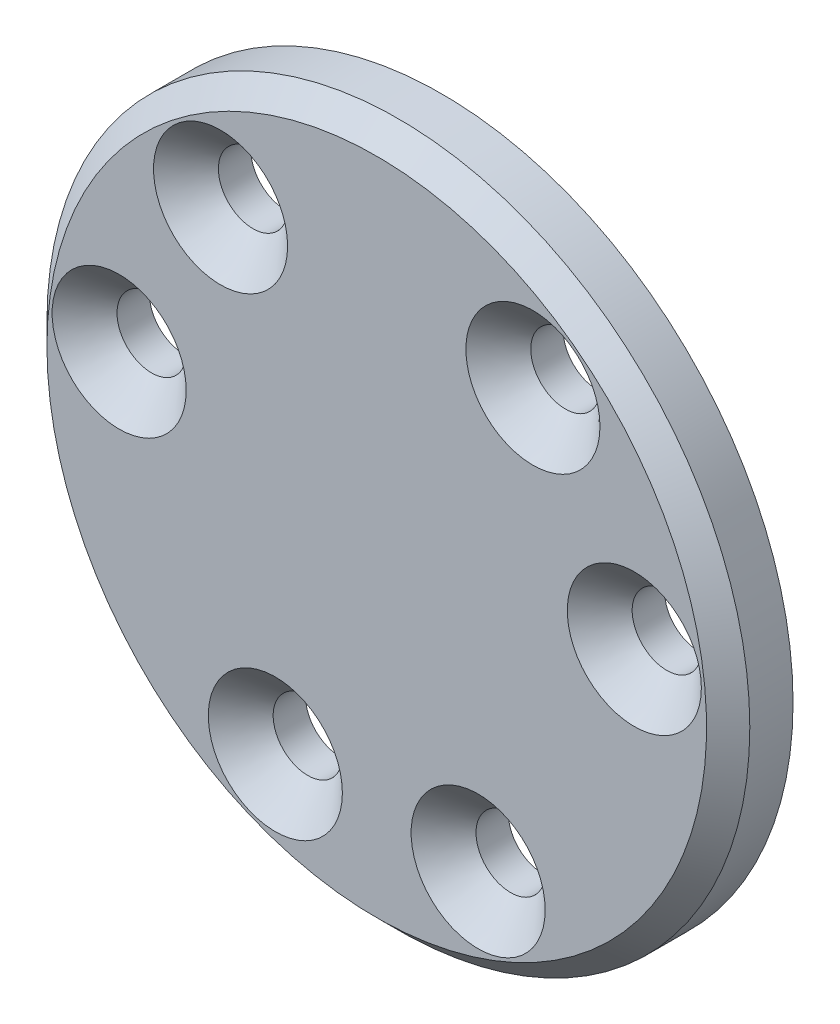
ISO-10303-21;
HEADER;
FILE_DESCRIPTION(('STEP AP214'),'2;1');
FILE_NAME('part.step','',(''),(''),'','','');
FILE_SCHEMA(('AUTOMOTIVE_DESIGN { 1 0 10303 214 1 1 1 1 }'));
ENDSEC;
DATA;
#1=APPLICATION_CONTEXT('core data for automotive mechanical design processes');
#2=APPLICATION_PROTOCOL_DEFINITION('international standard','automotive_design',2000,#1);
#3=PRODUCT_CONTEXT('',#1,'mechanical');
#4=PRODUCT('Part','Part','',(#3));
#5=PRODUCT_RELATED_PRODUCT_CATEGORY('part','',(#4));
#6=PRODUCT_DEFINITION_FORMATION('','',#4);
#7=PRODUCT_DEFINITION_CONTEXT('part definition',#1,'design');
#8=PRODUCT_DEFINITION('design','',#6,#7);
#9=PRODUCT_DEFINITION_SHAPE('','',#8);
#10=(LENGTH_UNIT() NAMED_UNIT(*) SI_UNIT(.MILLI.,.METRE.));
#11=(NAMED_UNIT(*) PLANE_ANGLE_UNIT() SI_UNIT($,.RADIAN.));
#12=(NAMED_UNIT(*) SI_UNIT($,.STERADIAN.) SOLID_ANGLE_UNIT());
#13=UNCERTAINTY_MEASURE_WITH_UNIT(LENGTH_MEASURE(1.E-05),#10,'distance_accuracy_value','');
#14=(GEOMETRIC_REPRESENTATION_CONTEXT(3) GLOBAL_UNCERTAINTY_ASSIGNED_CONTEXT((#13)) GLOBAL_UNIT_ASSIGNED_CONTEXT((#10,
#11,#12)) REPRESENTATION_CONTEXT('',''));
#15=CARTESIAN_POINT('',(0.,0.,0.));
#16=DIRECTION('',(0.,0.,1.));
#17=DIRECTION('',(1.,0.,0.));
#18=AXIS2_PLACEMENT_3D('',#15,#16,#17);
#19=CARTESIAN_POINT('',(0.,0.,0.));
#20=DIRECTION('',(0.,0.,-1.));
#21=DIRECTION('',(-1.,0.,0.));
#22=AXIS2_PLACEMENT_3D('',#19,#20,#21);
#23=CYLINDRICAL_SURFACE('',#22,16.25);
#24=CARTESIAN_POINT('',(0.,0.,0.));
#25=DIRECTION('',(0.,0.,-1.));
#26=DIRECTION('',(-1.,0.,0.));
#27=AXIS2_PLACEMENT_3D('',#24,#25,#26);
#28=CIRCLE('',#27,16.25);
#29=CARTESIAN_POINT('',(-16.25,0.,0.));
#30=VERTEX_POINT('',#29);
#31=EDGE_CURVE('E17',#30,#30,#28,.T.);
#32=ORIENTED_EDGE('',*,*,#31,.F.);
#33=EDGE_LOOP('',(#32));
#34=FACE_BOUND('',#33,.T.);
#35=CARTESIAN_POINT('',(0.,0.,2.));
#36=DIRECTION('',(0.,0.,-1.));
#37=DIRECTION('',(-1.,0.,0.));
#38=AXIS2_PLACEMENT_3D('',#35,#36,#37);
#39=CIRCLE('',#38,16.25);
#40=CARTESIAN_POINT('',(-16.25,0.,2.));
#41=VERTEX_POINT('',#40);
#42=EDGE_CURVE('E30',#41,#41,#39,.F.);
#43=ORIENTED_EDGE('',*,*,#42,.F.);
#44=EDGE_LOOP('',(#43));
#45=FACE_BOUND('',#44,.T.);
#46=ADVANCED_FACE('F14',(#34,#45),#23,.T.);
#47=CARTESIAN_POINT('',(-7.221780278,9.583626121,0.));
#48=DIRECTION('',(0.,0.,1.));
#49=DIRECTION('',(1.,0.,0.));
#50=AXIS2_PLACEMENT_3D('',#47,#48,#49);
#51=CYLINDRICAL_SURFACE('',#50,1.6);
#52=CARTESIAN_POINT('',(-7.221780278,9.583626121,0.));
#53=DIRECTION('',(0.,0.,1.));
#54=DIRECTION('',(1.,0.,0.));
#55=AXIS2_PLACEMENT_3D('',#52,#53,#54);
#56=CIRCLE('',#55,1.6);
#57=CARTESIAN_POINT('',(-5.621780278,9.583626121,0.));
#58=VERTEX_POINT('',#57);
#59=EDGE_CURVE('E59',#58,#58,#56,.T.);
#60=ORIENTED_EDGE('',*,*,#59,.F.);
#61=EDGE_LOOP('',(#60));
#62=FACE_BOUND('',#61,.T.);
#63=CARTESIAN_POINT('',(-7.221780278,9.583626121,1.49999999999995));
#64=DIRECTION('',(0.,0.,1.));
#65=DIRECTION('',(1.,0.,0.));
#66=AXIS2_PLACEMENT_3D('',#63,#64,#65);
#67=CIRCLE('',#66,1.6);
#68=CARTESIAN_POINT('',(-5.621780278,9.583626121,1.5));
#69=VERTEX_POINT('',#68);
#70=EDGE_CURVE('E79',#69,#69,#67,.F.);
#71=ORIENTED_EDGE('',*,*,#70,.F.);
#72=EDGE_LOOP('',(#71));
#73=FACE_BOUND('',#72,.T.);
#74=ADVANCED_FACE('F75',(#62,#73),#51,.F.);
#75=CARTESIAN_POINT('',(11.91055382,1.462432121,0.));
#76=DIRECTION('',(0.,0.,1.));
#77=DIRECTION('',(1.,0.,0.));
#78=AXIS2_PLACEMENT_3D('',#75,#76,#77);
#79=CYLINDRICAL_SURFACE('',#78,1.6);
#80=CARTESIAN_POINT('',(11.91055382,1.462432121,0.));
#81=DIRECTION('',(0.,0.,1.));
#82=DIRECTION('',(1.,0.,0.));
#83=AXIS2_PLACEMENT_3D('',#80,#81,#82);
#84=CIRCLE('',#83,1.6);
#85=CARTESIAN_POINT('',(13.51055382,1.462432121,0.));
#86=VERTEX_POINT('',#85);
#87=EDGE_CURVE('E56',#86,#86,#84,.T.);
#88=ORIENTED_EDGE('',*,*,#87,.F.);
#89=EDGE_LOOP('',(#88));
#90=FACE_BOUND('',#89,.T.);
#91=CARTESIAN_POINT('',(11.91055382,1.462432121,1.49999999999995));
#92=DIRECTION('',(0.,0.,1.));
#93=DIRECTION('',(1.,0.,0.));
#94=AXIS2_PLACEMENT_3D('',#91,#92,#93);
#95=CIRCLE('',#94,1.6);
#96=CARTESIAN_POINT('',(13.51055382,1.462432121,1.5));
#97=VERTEX_POINT('',#96);
#98=EDGE_CURVE('E81',#97,#97,#95,.F.);
#99=ORIENTED_EDGE('',*,*,#98,.F.);
#100=EDGE_LOOP('',(#99));
#101=FACE_BOUND('',#100,.T.);
#102=ADVANCED_FACE('F232',(#90,#101),#79,.F.);
#103=CARTESIAN_POINT('',(7.221780278,9.583626121,0.));
#104=DIRECTION('',(0.,0.,1.));
#105=DIRECTION('',(1.,0.,0.));
#106=AXIS2_PLACEMENT_3D('',#103,#104,#105);
#107=CYLINDRICAL_SURFACE('',#106,1.6);
#108=CARTESIAN_POINT('',(7.221780278,9.583626121,0.));
#109=DIRECTION('',(0.,0.,1.));
#110=DIRECTION('',(1.,0.,0.));
#111=AXIS2_PLACEMENT_3D('',#108,#109,#110);
#112=CIRCLE('',#111,1.6);
#113=CARTESIAN_POINT('',(8.821780278,9.583626121,0.));
#114=VERTEX_POINT('',#113);
#115=EDGE_CURVE('E53',#114,#114,#112,.T.);
#116=ORIENTED_EDGE('',*,*,#115,.F.);
#117=EDGE_LOOP('',(#116));
#118=FACE_BOUND('',#117,.T.);
#119=CARTESIAN_POINT('',(7.221780278,9.583626121,1.49999999999995));
#120=DIRECTION('',(0.,0.,1.));
#121=DIRECTION('',(1.,0.,0.));
#122=AXIS2_PLACEMENT_3D('',#119,#120,#121);
#123=CIRCLE('',#122,1.6);
#124=CARTESIAN_POINT('',(8.821780278,9.583626121,1.5));
#125=VERTEX_POINT('',#124);
#126=EDGE_CURVE('E85',#125,#125,#123,.F.);
#127=ORIENTED_EDGE('',*,*,#126,.F.);
#128=EDGE_LOOP('',(#127));
#129=FACE_BOUND('',#128,.T.);
#130=ADVANCED_FACE('F112',(#118,#129),#107,.F.);
#131=CARTESIAN_POINT('',(4.688773542,-11.046058241,0.));
#132=DIRECTION('',(0.,0.,1.));
#133=DIRECTION('',(1.,0.,0.));
#134=AXIS2_PLACEMENT_3D('',#131,#132,#133);
#135=CYLINDRICAL_SURFACE('',#134,1.6);
#136=CARTESIAN_POINT('',(4.688773542,-11.046058241,0.));
#137=DIRECTION('',(0.,0.,1.));
#138=DIRECTION('',(1.,0.,0.));
#139=AXIS2_PLACEMENT_3D('',#136,#137,#138);
#140=CIRCLE('',#139,1.6);
#141=CARTESIAN_POINT('',(6.288773542,-11.046058241,0.));
#142=VERTEX_POINT('',#141);
#143=EDGE_CURVE('E64',#142,#142,#140,.T.);
#144=ORIENTED_EDGE('',*,*,#143,.F.);
#145=EDGE_LOOP('',(#144));
#146=FACE_BOUND('',#145,.T.);
#147=CARTESIAN_POINT('',(4.688773542,-11.046058241,1.49999999999995));
#148=DIRECTION('',(0.,0.,1.));
#149=DIRECTION('',(1.,0.,0.));
#150=AXIS2_PLACEMENT_3D('',#147,#148,#149);
#151=CIRCLE('',#150,1.6);
#152=CARTESIAN_POINT('',(6.288773542,-11.046058241,1.5));
#153=VERTEX_POINT('',#152);
#154=EDGE_CURVE('E90',#153,#153,#151,.F.);
#155=ORIENTED_EDGE('',*,*,#154,.F.);
#156=EDGE_LOOP('',(#155));
#157=FACE_BOUND('',#156,.T.);
#158=ADVANCED_FACE('F101',(#146,#157),#135,.F.);
#159=CARTESIAN_POINT('',(-4.688773542,-11.046058241,0.));
#160=DIRECTION('',(0.,0.,1.));
#161=DIRECTION('',(1.,0.,0.));
#162=AXIS2_PLACEMENT_3D('',#159,#160,#161);
#163=CYLINDRICAL_SURFACE('',#162,1.6);
#164=CARTESIAN_POINT('',(-4.688773542,-11.046058241,0.));
#165=DIRECTION('',(0.,0.,1.));
#166=DIRECTION('',(1.,0.,0.));
#167=AXIS2_PLACEMENT_3D('',#164,#165,#166);
#168=CIRCLE('',#167,1.6);
#169=CARTESIAN_POINT('',(-3.088773542,-11.046058241,0.));
#170=VERTEX_POINT('',#169);
#171=EDGE_CURVE('E62',#170,#170,#168,.T.);
#172=ORIENTED_EDGE('',*,*,#171,.F.);
#173=EDGE_LOOP('',(#172));
#174=FACE_BOUND('',#173,.T.);
#175=CARTESIAN_POINT('',(-4.688773542,-11.046058241,1.49999999999995));
#176=DIRECTION('',(0.,0.,1.));
#177=DIRECTION('',(1.,0.,0.));
#178=AXIS2_PLACEMENT_3D('',#175,#176,#177);
#179=CIRCLE('',#178,1.6);
#180=CARTESIAN_POINT('',(-3.088773542,-11.046058241,1.5));
#181=VERTEX_POINT('',#180);
#182=EDGE_CURVE('E52',#181,#181,#179,.F.);
#183=ORIENTED_EDGE('',*,*,#182,.F.);
#184=EDGE_LOOP('',(#183));
#185=FACE_BOUND('',#184,.T.);
#186=ADVANCED_FACE('F99',(#174,#185),#163,.F.);
#187=CARTESIAN_POINT('',(0.,0.,0.));
#188=DIRECTION('',(0.,0.,1.));
#189=DIRECTION('',(1.,0.,0.));
#190=AXIS2_PLACEMENT_3D('',#187,#188,#189);
#191=PLANE('',#190);
#192=ORIENTED_EDGE('',*,*,#115,.T.);
#193=EDGE_LOOP('',(#192));
#194=FACE_BOUND('',#193,.T.);
#195=ORIENTED_EDGE('',*,*,#87,.T.);
#196=EDGE_LOOP('',(#195));
#197=FACE_BOUND('',#196,.T.);
#198=ORIENTED_EDGE('',*,*,#59,.T.);
#199=EDGE_LOOP('',(#198));
#200=FACE_BOUND('',#199,.T.);
#201=CARTESIAN_POINT('',(-11.91055382,1.462432121,0.));
#202=DIRECTION('',(0.,0.,1.));
#203=DIRECTION('',(1.,0.,0.));
#204=AXIS2_PLACEMENT_3D('',#201,#202,#203);
#205=CIRCLE('',#204,1.6);
#206=CARTESIAN_POINT('',(-10.31055382,1.462432121,0.));
#207=VERTEX_POINT('',#206);
#208=EDGE_CURVE('E49',#207,#207,#205,.F.);
#209=ORIENTED_EDGE('',*,*,#208,.F.);
#210=EDGE_LOOP('',(#209));
#211=FACE_BOUND('',#210,.T.);
#212=ORIENTED_EDGE('',*,*,#171,.T.);
#213=EDGE_LOOP('',(#212));
#214=FACE_BOUND('',#213,.T.);
#215=ORIENTED_EDGE('',*,*,#143,.T.);
#216=EDGE_LOOP('',(#215));
#217=FACE_BOUND('',#216,.T.);
#218=ORIENTED_EDGE('',*,*,#31,.T.);
#219=EDGE_LOOP('',(#218));
#220=FACE_BOUND('',#219,.T.);
#221=ADVANCED_FACE('F71',(#194,#197,#200,#211,#214,#217,#220),#191,.F.);
#222=CARTESIAN_POINT('',(0.,0.,2.));
#223=DIRECTION('',(0.,0.,-1.));
#224=DIRECTION('',(-1.,0.,0.));
#225=AXIS2_PLACEMENT_3D('',#222,#223,#224);
#226=CONICAL_SURFACE('',#225,16.25,0.785398163397449);
#227=ORIENTED_EDGE('',*,*,#42,.T.);
#228=EDGE_LOOP('',(#227));
#229=FACE_BOUND('',#228,.T.);
#230=CARTESIAN_POINT('',(0.,0.,2.99999999999989));
#231=DIRECTION('',(0.,0.,-1.));
#232=DIRECTION('',(-1.,0.,0.));
#233=AXIS2_PLACEMENT_3D('',#230,#231,#232);
#234=CIRCLE('',#233,15.2500000000001);
#235=CARTESIAN_POINT('',(-15.2500000000001,0.,2.99999999999989));
#236=VERTEX_POINT('',#235);
#237=EDGE_CURVE('E46',#236,#236,#234,.F.);
#238=ORIENTED_EDGE('',*,*,#237,.F.);
#239=EDGE_LOOP('',(#238));
#240=FACE_BOUND('',#239,.T.);
#241=ADVANCED_FACE('F109',(#229,#240),#226,.T.);
#242=CARTESIAN_POINT('',(-7.221780278,9.583626121,1.5));
#243=DIRECTION('',(0.,0.,1.));
#244=DIRECTION('',(1.,0.,0.));
#245=AXIS2_PLACEMENT_3D('',#242,#243,#244);
#246=CONICAL_SURFACE('',#245,1.6,0.785398163397449);
#247=ORIENTED_EDGE('',*,*,#70,.T.);
#248=EDGE_LOOP('',(#247));
#249=FACE_BOUND('',#248,.T.);
#250=CARTESIAN_POINT('',(-7.221780278,9.583626121,3.00000000017542));
#251=DIRECTION('',(0.,0.,1.));
#252=DIRECTION('',(1.,0.,0.));
#253=AXIS2_PLACEMENT_3D('',#250,#251,#252);
#254=CIRCLE('',#253,3.10000000017542);
#255=CARTESIAN_POINT('',(-4.12178027782458,9.583626121,3.00000000017542));
#256=VERTEX_POINT('',#255);
#257=EDGE_CURVE('E43',#256,#256,#254,.F.);
#258=ORIENTED_EDGE('',*,*,#257,.F.);
#259=EDGE_LOOP('',(#258));
#260=FACE_BOUND('',#259,.T.);
#261=ADVANCED_FACE('F144',(#249,#260),#246,.F.);
#262=CARTESIAN_POINT('',(11.91055382,1.462432121,1.5));
#263=DIRECTION('',(0.,0.,1.));
#264=DIRECTION('',(1.,0.,0.));
#265=AXIS2_PLACEMENT_3D('',#262,#263,#264);
#266=CONICAL_SURFACE('',#265,1.6,0.785398163397449);
#267=ORIENTED_EDGE('',*,*,#98,.T.);
#268=EDGE_LOOP('',(#267));
#269=FACE_BOUND('',#268,.T.);
#270=CARTESIAN_POINT('',(11.91055382,1.462432121,2.9999999996958));
#271=DIRECTION('',(0.,0.,1.));
#272=DIRECTION('',(1.,0.,0.));
#273=AXIS2_PLACEMENT_3D('',#270,#271,#272);
#274=CIRCLE('',#273,3.0999999996958);
#275=CARTESIAN_POINT('',(15.0105538196958,1.462432121,2.9999999996958));
#276=VERTEX_POINT('',#275);
#277=EDGE_CURVE('E40',#276,#276,#274,.F.);
#278=ORIENTED_EDGE('',*,*,#277,.F.);
#279=EDGE_LOOP('',(#278));
#280=FACE_BOUND('',#279,.T.);
#281=ADVANCED_FACE('F140',(#269,#280),#266,.F.);
#282=CARTESIAN_POINT('',(7.221780278,9.583626121,1.5));
#283=DIRECTION('',(0.,0.,1.));
#284=DIRECTION('',(1.,0.,0.));
#285=AXIS2_PLACEMENT_3D('',#282,#283,#284);
#286=CONICAL_SURFACE('',#285,1.6,0.785398163397448);
#287=ORIENTED_EDGE('',*,*,#126,.T.);
#288=EDGE_LOOP('',(#287));
#289=FACE_BOUND('',#288,.T.);
#290=CARTESIAN_POINT('',(7.221780278,9.583626121,2.99999999982459));
#291=DIRECTION('',(0.,0.,1.));
#292=DIRECTION('',(1.,0.,0.));
#293=AXIS2_PLACEMENT_3D('',#290,#291,#292);
#294=CIRCLE('',#293,3.09999999982459);
#295=CARTESIAN_POINT('',(10.3217802778246,9.583626121,2.99999999982459));
#296=VERTEX_POINT('',#295);
#297=EDGE_CURVE('E37',#296,#296,#294,.F.);
#298=ORIENTED_EDGE('',*,*,#297,.F.);
#299=EDGE_LOOP('',(#298));
#300=FACE_BOUND('',#299,.T.);
#301=ADVANCED_FACE('F136',(#289,#300),#286,.F.);
#302=CARTESIAN_POINT('',(4.688773542,-11.046058241,1.5));
#303=DIRECTION('',(0.,0.,1.));
#304=DIRECTION('',(1.,0.,0.));
#305=AXIS2_PLACEMENT_3D('',#302,#303,#304);
#306=CONICAL_SURFACE('',#305,1.6,0.785398163397448);
#307=ORIENTED_EDGE('',*,*,#154,.T.);
#308=EDGE_LOOP('',(#307));
#309=FACE_BOUND('',#308,.T.);
#310=CARTESIAN_POINT('',(4.688773542,-11.046058241,2.99999999987122));
#311=DIRECTION('',(0.,0.,1.));
#312=DIRECTION('',(1.,0.,0.));
#313=AXIS2_PLACEMENT_3D('',#310,#311,#312);
#314=CIRCLE('',#313,3.09999999987122);
#315=CARTESIAN_POINT('',(7.78877354187122,-11.046058241,2.99999999987122));
#316=VERTEX_POINT('',#315);
#317=EDGE_CURVE('E34',#316,#316,#314,.F.);
#318=ORIENTED_EDGE('',*,*,#317,.F.);
#319=EDGE_LOOP('',(#318));
#320=FACE_BOUND('',#319,.T.);
#321=ADVANCED_FACE('F133',(#309,#320),#306,.F.);
#322=CARTESIAN_POINT('',(-4.688773542,-11.046058241,1.5));
#323=DIRECTION('',(0.,0.,1.));
#324=DIRECTION('',(1.,0.,0.));
#325=AXIS2_PLACEMENT_3D('',#322,#323,#324);
#326=CONICAL_SURFACE('',#325,1.6,0.785398163397449);
#327=ORIENTED_EDGE('',*,*,#182,.T.);
#328=EDGE_LOOP('',(#327));
#329=FACE_BOUND('',#328,.T.);
#330=CARTESIAN_POINT('',(-4.688773542,-11.046058241,3.00000000012879));
#331=DIRECTION('',(0.,0.,1.));
#332=DIRECTION('',(1.,0.,0.));
#333=AXIS2_PLACEMENT_3D('',#330,#331,#332);
#334=CIRCLE('',#333,3.10000000012879);
#335=CARTESIAN_POINT('',(-1.58877354187121,-11.046058241,3.00000000012879));
#336=VERTEX_POINT('',#335);
#337=EDGE_CURVE('E26',#336,#336,#334,.F.);
#338=ORIENTED_EDGE('',*,*,#337,.F.);
#339=EDGE_LOOP('',(#338));
#340=FACE_BOUND('',#339,.T.);
#341=ADVANCED_FACE('F96',(#329,#340),#326,.F.);
#342=CARTESIAN_POINT('',(-11.91055382,1.462432121,0.));
#343=DIRECTION('',(0.,0.,1.));
#344=DIRECTION('',(1.,0.,0.));
#345=AXIS2_PLACEMENT_3D('',#342,#343,#344);
#346=CYLINDRICAL_SURFACE('',#345,1.6);
#347=CARTESIAN_POINT('',(-11.91055382,1.462432121,1.49999999999995));
#348=DIRECTION('',(0.,0.,1.));
#349=DIRECTION('',(1.,0.,0.));
#350=AXIS2_PLACEMENT_3D('',#347,#348,#349);
#351=CIRCLE('',#350,1.6);
#352=CARTESIAN_POINT('',(-10.31055382,1.462432121,1.5));
#353=VERTEX_POINT('',#352);
#354=EDGE_CURVE('E21',#353,#353,#351,.F.);
#355=ORIENTED_EDGE('',*,*,#354,.F.);
#356=EDGE_LOOP('',(#355));
#357=FACE_BOUND('',#356,.T.);
#358=ORIENTED_EDGE('',*,*,#208,.T.);
#359=EDGE_LOOP('',(#358));
#360=FACE_BOUND('',#359,.T.);
#361=ADVANCED_FACE('F123',(#357,#360),#346,.F.);
#362=CARTESIAN_POINT('',(0.,0.,3.));
#363=DIRECTION('',(0.,0.,1.));
#364=DIRECTION('',(1.,0.,0.));
#365=AXIS2_PLACEMENT_3D('',#362,#363,#364);
#366=PLANE('',#365);
#367=CARTESIAN_POINT('',(-11.91055382,1.462432121,3.));
#368=DIRECTION('',(0.,0.,1.));
#369=DIRECTION('',(1.,0.,0.));
#370=AXIS2_PLACEMENT_3D('',#367,#368,#369);
#371=CIRCLE('',#370,3.1);
#372=CARTESIAN_POINT('',(-8.81055382,1.462432121,3.));
#373=VERTEX_POINT('',#372);
#374=EDGE_CURVE('E10',#373,#373,#371,.T.);
#375=ORIENTED_EDGE('',*,*,#374,.F.);
#376=EDGE_LOOP('',(#375));
#377=FACE_BOUND('',#376,.T.);
#378=ORIENTED_EDGE('',*,*,#337,.T.);
#379=EDGE_LOOP('',(#378));
#380=FACE_BOUND('',#379,.T.);
#381=ORIENTED_EDGE('',*,*,#317,.T.);
#382=EDGE_LOOP('',(#381));
#383=FACE_BOUND('',#382,.T.);
#384=ORIENTED_EDGE('',*,*,#297,.T.);
#385=EDGE_LOOP('',(#384));
#386=FACE_BOUND('',#385,.T.);
#387=ORIENTED_EDGE('',*,*,#277,.T.);
#388=EDGE_LOOP('',(#387));
#389=FACE_BOUND('',#388,.T.);
#390=ORIENTED_EDGE('',*,*,#257,.T.);
#391=EDGE_LOOP('',(#390));
#392=FACE_BOUND('',#391,.T.);
#393=ORIENTED_EDGE('',*,*,#237,.T.);
#394=EDGE_LOOP('',(#393));
#395=FACE_BOUND('',#394,.T.);
#396=ADVANCED_FACE('F118',(#377,#380,#383,#386,#389,#392,#395),#366,.T.);
#397=CARTESIAN_POINT('',(-11.91055382,1.462432121,1.5));
#398=DIRECTION('',(0.,0.,1.));
#399=DIRECTION('',(1.,0.,0.));
#400=AXIS2_PLACEMENT_3D('',#397,#398,#399);
#401=CONICAL_SURFACE('',#400,1.6,0.785398163397448);
#402=ORIENTED_EDGE('',*,*,#374,.T.);
#403=EDGE_LOOP('',(#402));
#404=FACE_BOUND('',#403,.T.);
#405=ORIENTED_EDGE('',*,*,#354,.T.);
#406=EDGE_LOOP('',(#405));
#407=FACE_BOUND('',#406,.T.);
#408=ADVANCED_FACE('F116',(#404,#407),#401,.F.);
#409=CLOSED_SHELL('',(#46,#74,#102,#130,#158,#186,#221,#241,#261,#281,#301,#321,#341,#361,#396,#408));
#410=MANIFOLD_SOLID_BREP('B1',#409);
#411=ADVANCED_BREP_SHAPE_REPRESENTATION('',(#18,#410),#14);
#412=SHAPE_DEFINITION_REPRESENTATION(#9,#411);
ENDSEC;
END-ISO-10303-21;
